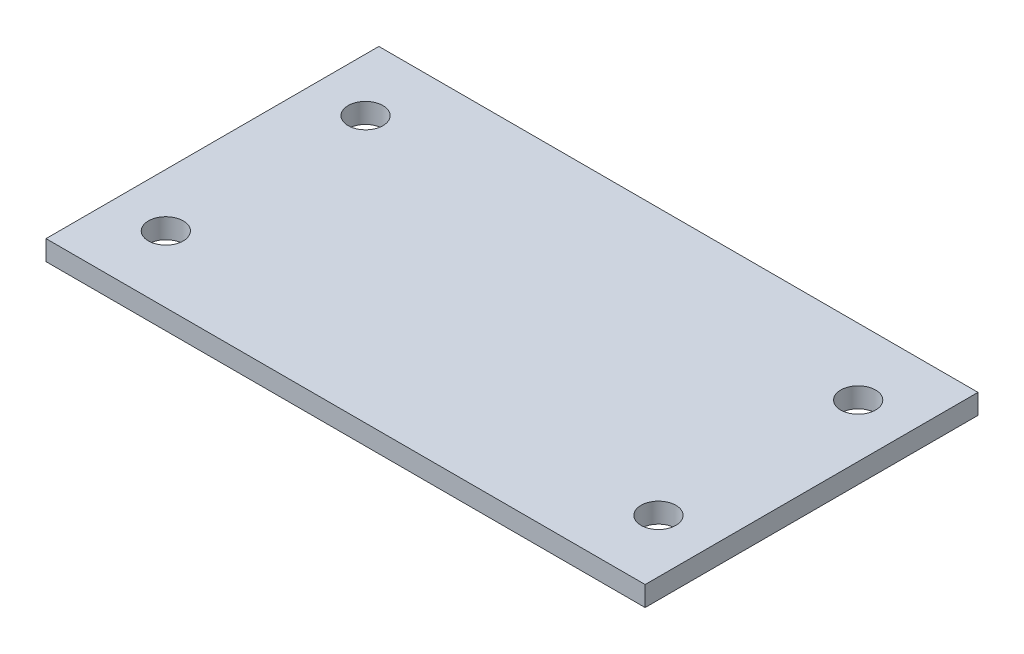
ISO-10303-21;
HEADER;
FILE_DESCRIPTION(('STEP AP214'),'2;1');
FILE_NAME('part.step','',(''),(''),'','','');
FILE_SCHEMA(('AUTOMOTIVE_DESIGN { 1 0 10303 214 1 1 1 1 }'));
ENDSEC;
DATA;
#1=APPLICATION_CONTEXT('core data for automotive mechanical design processes');
#2=APPLICATION_PROTOCOL_DEFINITION('international standard','automotive_design',2000,#1);
#3=PRODUCT_CONTEXT('',#1,'mechanical');
#4=PRODUCT('Part','Part','',(#3));
#5=PRODUCT_RELATED_PRODUCT_CATEGORY('part','',(#4));
#6=PRODUCT_DEFINITION_FORMATION('','',#4);
#7=PRODUCT_DEFINITION_CONTEXT('part definition',#1,'design');
#8=PRODUCT_DEFINITION('design','',#6,#7);
#9=PRODUCT_DEFINITION_SHAPE('','',#8);
#10=(LENGTH_UNIT() NAMED_UNIT(*) SI_UNIT(.MILLI.,.METRE.));
#11=(NAMED_UNIT(*) PLANE_ANGLE_UNIT() SI_UNIT($,.RADIAN.));
#12=(NAMED_UNIT(*) SI_UNIT($,.STERADIAN.) SOLID_ANGLE_UNIT());
#13=UNCERTAINTY_MEASURE_WITH_UNIT(LENGTH_MEASURE(1.E-05),#10,'distance_accuracy_value','');
#14=(GEOMETRIC_REPRESENTATION_CONTEXT(3) GLOBAL_UNCERTAINTY_ASSIGNED_CONTEXT((#13)) GLOBAL_UNIT_ASSIGNED_CONTEXT((#10,
#11,#12)) REPRESENTATION_CONTEXT('',''));
#15=CARTESIAN_POINT('',(0.,0.,0.));
#16=DIRECTION('',(0.,0.,1.));
#17=DIRECTION('',(1.,0.,0.));
#18=AXIS2_PLACEMENT_3D('',#15,#16,#17);
#19=CARTESIAN_POINT('',(-45.,3.,25.));
#20=DIRECTION('',(-1.,0.,0.));
#21=DIRECTION('',(0.,0.,1.));
#22=AXIS2_PLACEMENT_3D('',#19,#20,#21);
#23=PLANE('',#22);
#24=DIRECTION('',(0.,0.,-1.));
#25=VECTOR('',#24,1.);
#26=CARTESIAN_POINT('',(-45.,0.,25.));
#27=LINE('',#26,#25);
#28=CARTESIAN_POINT('',(-45.,0.,25.));
#29=VERTEX_POINT('',#28);
#30=CARTESIAN_POINT('',(-45.,0.,-25.));
#31=VERTEX_POINT('',#30);
#32=EDGE_CURVE('E112',#29,#31,#27,.T.);
#33=ORIENTED_EDGE('',*,*,#32,.F.);
#34=DIRECTION('',(0.,-1.,0.));
#35=VECTOR('',#34,1.);
#36=CARTESIAN_POINT('',(-45.,3.,25.));
#37=LINE('',#36,#35);
#38=CARTESIAN_POINT('',(-45.,3.,25.));
#39=VERTEX_POINT('',#38);
#40=EDGE_CURVE('E11',#39,#29,#37,.T.);
#41=ORIENTED_EDGE('',*,*,#40,.F.);
#42=DIRECTION('',(0.,0.,-1.));
#43=VECTOR('',#42,1.);
#44=CARTESIAN_POINT('',(-45.,3.,25.));
#45=LINE('',#44,#43);
#46=CARTESIAN_POINT('',(-45.,3.,-25.));
#47=VERTEX_POINT('',#46);
#48=EDGE_CURVE('E104',#39,#47,#45,.T.);
#49=ORIENTED_EDGE('',*,*,#48,.T.);
#50=DIRECTION('',(0.,-1.,0.));
#51=VECTOR('',#50,1.);
#52=CARTESIAN_POINT('',(-45.,3.,-25.));
#53=LINE('',#52,#51);
#54=EDGE_CURVE('E80',#47,#31,#53,.T.);
#55=ORIENTED_EDGE('',*,*,#54,.T.);
#56=EDGE_LOOP('',(#33,#41,#49,#55));
#57=FACE_BOUND('',#56,.T.);
#58=ADVANCED_FACE('F38',(#57),#23,.T.);
#59=CARTESIAN_POINT('',(-45.,3.,25.));
#60=DIRECTION('',(0.,0.,-1.));
#61=DIRECTION('',(-1.,0.,0.));
#62=AXIS2_PLACEMENT_3D('',#59,#60,#61);
#63=PLANE('',#62);
#64=DIRECTION('',(1.,0.,0.));
#65=VECTOR('',#64,1.);
#66=CARTESIAN_POINT('',(-45.,0.,25.));
#67=LINE('',#66,#65);
#68=CARTESIAN_POINT('',(45.,0.,25.));
#69=VERTEX_POINT('',#68);
#70=EDGE_CURVE('E72',#29,#69,#67,.T.);
#71=ORIENTED_EDGE('',*,*,#70,.T.);
#72=DIRECTION('',(0.,-1.,0.));
#73=VECTOR('',#72,1.);
#74=CARTESIAN_POINT('',(45.,3.,25.));
#75=LINE('',#74,#73);
#76=CARTESIAN_POINT('',(45.,3.,25.));
#77=VERTEX_POINT('',#76);
#78=EDGE_CURVE('E48',#77,#69,#75,.T.);
#79=ORIENTED_EDGE('',*,*,#78,.F.);
#80=DIRECTION('',(1.,0.,0.));
#81=VECTOR('',#80,1.);
#82=CARTESIAN_POINT('',(-45.,3.,25.));
#83=LINE('',#82,#81);
#84=EDGE_CURVE('E90',#39,#77,#83,.T.);
#85=ORIENTED_EDGE('',*,*,#84,.F.);
#86=ORIENTED_EDGE('',*,*,#40,.T.);
#87=EDGE_LOOP('',(#71,#79,#85,#86));
#88=FACE_BOUND('',#87,.T.);
#89=ADVANCED_FACE('F158',(#88),#63,.F.);
#90=CARTESIAN_POINT('',(45.,3.,25.));
#91=DIRECTION('',(-1.,0.,0.));
#92=DIRECTION('',(0.,0.,1.));
#93=AXIS2_PLACEMENT_3D('',#90,#91,#92);
#94=PLANE('',#93);
#95=DIRECTION('',(0.,0.,-1.));
#96=VECTOR('',#95,1.);
#97=CARTESIAN_POINT('',(45.,0.,25.));
#98=LINE('',#97,#96);
#99=CARTESIAN_POINT('',(45.,0.,-25.));
#100=VERTEX_POINT('',#99);
#101=EDGE_CURVE('E98',#69,#100,#98,.T.);
#102=ORIENTED_EDGE('',*,*,#101,.T.);
#103=DIRECTION('',(0.,-1.,0.));
#104=VECTOR('',#103,1.);
#105=CARTESIAN_POINT('',(45.,3.,-25.));
#106=LINE('',#105,#104);
#107=CARTESIAN_POINT('',(45.,3.,-25.));
#108=VERTEX_POINT('',#107);
#109=EDGE_CURVE('E95',#108,#100,#106,.T.);
#110=ORIENTED_EDGE('',*,*,#109,.F.);
#111=DIRECTION('',(0.,0.,-1.));
#112=VECTOR('',#111,1.);
#113=CARTESIAN_POINT('',(45.,3.,25.));
#114=LINE('',#113,#112);
#115=EDGE_CURVE('E85',#77,#108,#114,.T.);
#116=ORIENTED_EDGE('',*,*,#115,.F.);
#117=ORIENTED_EDGE('',*,*,#78,.T.);
#118=EDGE_LOOP('',(#102,#110,#116,#117));
#119=FACE_BOUND('',#118,.T.);
#120=ADVANCED_FACE('F96',(#119),#94,.F.);
#121=CARTESIAN_POINT('',(-45.,3.,-25.));
#122=DIRECTION('',(0.,0.,-1.));
#123=DIRECTION('',(-1.,0.,0.));
#124=AXIS2_PLACEMENT_3D('',#121,#122,#123);
#125=PLANE('',#124);
#126=DIRECTION('',(1.,0.,0.));
#127=VECTOR('',#126,1.);
#128=CARTESIAN_POINT('',(-45.,0.,-25.));
#129=LINE('',#128,#127);
#130=EDGE_CURVE('E116',#31,#100,#129,.T.);
#131=ORIENTED_EDGE('',*,*,#130,.F.);
#132=ORIENTED_EDGE('',*,*,#54,.F.);
#133=DIRECTION('',(1.,0.,0.));
#134=VECTOR('',#133,1.);
#135=CARTESIAN_POINT('',(-45.,3.,-25.));
#136=LINE('',#135,#134);
#137=EDGE_CURVE('E89',#47,#108,#136,.T.);
#138=ORIENTED_EDGE('',*,*,#137,.T.);
#139=ORIENTED_EDGE('',*,*,#109,.T.);
#140=EDGE_LOOP('',(#131,#132,#138,#139));
#141=FACE_BOUND('',#140,.T.);
#142=ADVANCED_FACE('F102',(#141),#125,.T.);
#143=CARTESIAN_POINT('',(0.,3.,0.));
#144=DIRECTION('',(0.,-1.,0.));
#145=DIRECTION('',(0.,0.,-1.));
#146=AXIS2_PLACEMENT_3D('',#143,#144,#145);
#147=PLANE('',#146);
#148=CARTESIAN_POINT('',(37.,3.,-15.));
#149=DIRECTION('',(0.,1.,0.));
#150=DIRECTION('',(0.,0.,-1.));
#151=AXIS2_PLACEMENT_3D('',#148,#149,#150);
#152=CIRCLE('',#151,2.616763909565);
#153=CARTESIAN_POINT('',(37.,3.,-12.383236090435));
#154=VERTEX_POINT('',#153);
#155=EDGE_CURVE('E203',#154,#154,#152,.T.);
#156=ORIENTED_EDGE('',*,*,#155,.F.);
#157=EDGE_LOOP('',(#156));
#158=FACE_BOUND('',#157,.T.);
#159=CARTESIAN_POINT('',(37.,3.,15.));
#160=DIRECTION('',(0.,1.,0.));
#161=DIRECTION('',(0.,0.,1.));
#162=AXIS2_PLACEMENT_3D('',#159,#160,#161);
#163=CIRCLE('',#162,2.616763909565);
#164=CARTESIAN_POINT('',(37.,3.,17.616763909565));
#165=VERTEX_POINT('',#164);
#166=EDGE_CURVE('E197',#165,#165,#163,.T.);
#167=ORIENTED_EDGE('',*,*,#166,.F.);
#168=EDGE_LOOP('',(#167));
#169=FACE_BOUND('',#168,.T.);
#170=CARTESIAN_POINT('',(-37.,3.,15.));
#171=DIRECTION('',(0.,1.,0.));
#172=DIRECTION('',(0.,0.,-1.));
#173=AXIS2_PLACEMENT_3D('',#170,#171,#172);
#174=CIRCLE('',#173,2.616763909565);
#175=CARTESIAN_POINT('',(-37.,3.,17.616763909565));
#176=VERTEX_POINT('',#175);
#177=EDGE_CURVE('E194',#176,#176,#174,.T.);
#178=ORIENTED_EDGE('',*,*,#177,.F.);
#179=EDGE_LOOP('',(#178));
#180=FACE_BOUND('',#179,.T.);
#181=CARTESIAN_POINT('',(-37.,3.,-15.));
#182=DIRECTION('',(0.,1.,0.));
#183=DIRECTION('',(0.,0.,1.));
#184=AXIS2_PLACEMENT_3D('',#181,#182,#183);
#185=CIRCLE('',#184,2.616763909565);
#186=CARTESIAN_POINT('',(-37.,3.,-12.383236090435));
#187=VERTEX_POINT('',#186);
#188=EDGE_CURVE('E132',#187,#187,#185,.T.);
#189=ORIENTED_EDGE('',*,*,#188,.F.);
#190=EDGE_LOOP('',(#189));
#191=FACE_BOUND('',#190,.T.);
#192=ORIENTED_EDGE('',*,*,#48,.F.);
#193=ORIENTED_EDGE('',*,*,#84,.T.);
#194=ORIENTED_EDGE('',*,*,#115,.T.);
#195=ORIENTED_EDGE('',*,*,#137,.F.);
#196=EDGE_LOOP('',(#192,#193,#194,#195));
#197=FACE_BOUND('',#196,.T.);
#198=ADVANCED_FACE('F88',(#158,#169,#180,#191,#197),#147,.F.);
#199=CARTESIAN_POINT('',(0.,0.,0.));
#200=DIRECTION('',(0.,-1.,0.));
#201=DIRECTION('',(0.,0.,-1.));
#202=AXIS2_PLACEMENT_3D('',#199,#200,#201);
#203=PLANE('',#202);
#204=CARTESIAN_POINT('',(37.,0.,-15.));
#205=DIRECTION('',(0.,-1.,0.));
#206=DIRECTION('',(0.,0.,-1.));
#207=AXIS2_PLACEMENT_3D('',#204,#205,#206);
#208=CIRCLE('',#207,2.616763909565);
#209=CARTESIAN_POINT('',(37.,0.,-12.383236090435));
#210=VERTEX_POINT('',#209);
#211=EDGE_CURVE('E41',#210,#210,#208,.T.);
#212=ORIENTED_EDGE('',*,*,#211,.F.);
#213=EDGE_LOOP('',(#212));
#214=FACE_BOUND('',#213,.T.);
#215=CARTESIAN_POINT('',(37.,0.,15.));
#216=DIRECTION('',(0.,-1.,0.));
#217=DIRECTION('',(0.,0.,-1.));
#218=AXIS2_PLACEMENT_3D('',#215,#216,#217);
#219=CIRCLE('',#218,2.616763909565);
#220=CARTESIAN_POINT('',(37.,0.,17.616763909565));
#221=VERTEX_POINT('',#220);
#222=EDGE_CURVE('E135',#221,#221,#219,.T.);
#223=ORIENTED_EDGE('',*,*,#222,.F.);
#224=EDGE_LOOP('',(#223));
#225=FACE_BOUND('',#224,.T.);
#226=CARTESIAN_POINT('',(-37.,0.,15.));
#227=DIRECTION('',(0.,-1.,0.));
#228=DIRECTION('',(0.,0.,-1.));
#229=AXIS2_PLACEMENT_3D('',#226,#227,#228);
#230=CIRCLE('',#229,2.616763909565);
#231=CARTESIAN_POINT('',(-37.,0.,17.616763909565));
#232=VERTEX_POINT('',#231);
#233=EDGE_CURVE('E131',#232,#232,#230,.T.);
#234=ORIENTED_EDGE('',*,*,#233,.F.);
#235=EDGE_LOOP('',(#234));
#236=FACE_BOUND('',#235,.T.);
#237=CARTESIAN_POINT('',(-37.,0.,-15.));
#238=DIRECTION('',(0.,-1.,0.));
#239=DIRECTION('',(0.,0.,-1.));
#240=AXIS2_PLACEMENT_3D('',#237,#238,#239);
#241=CIRCLE('',#240,2.616763909565);
#242=CARTESIAN_POINT('',(-37.,0.,-12.383236090435));
#243=VERTEX_POINT('',#242);
#244=EDGE_CURVE('E127',#243,#243,#241,.T.);
#245=ORIENTED_EDGE('',*,*,#244,.F.);
#246=EDGE_LOOP('',(#245));
#247=FACE_BOUND('',#246,.T.);
#248=ORIENTED_EDGE('',*,*,#32,.T.);
#249=ORIENTED_EDGE('',*,*,#130,.T.);
#250=ORIENTED_EDGE('',*,*,#101,.F.);
#251=ORIENTED_EDGE('',*,*,#70,.F.);
#252=EDGE_LOOP('',(#248,#249,#250,#251));
#253=FACE_BOUND('',#252,.T.);
#254=ADVANCED_FACE('F147',(#214,#225,#236,#247,#253),#203,.T.);
#255=CARTESIAN_POINT('',(-37.,-1.2E-05,-15.));
#256=DIRECTION('',(0.,1.,0.));
#257=DIRECTION('',(0.,0.,1.));
#258=AXIS2_PLACEMENT_3D('',#255,#256,#257);
#259=CYLINDRICAL_SURFACE('',#258,2.616763909565);
#260=CARTESIAN_POINT('',(-37.,0.,-12.383236090435));
#261=CARTESIAN_POINT('',(-37.,0.03125,-12.383236090435));
#262=CARTESIAN_POINT('',(-37.,0.0625,-12.383236090435));
#263=CARTESIAN_POINT('',(-37.,0.125,-12.383236090435));
#264=CARTESIAN_POINT('',(-37.,0.15625,-12.383236090435));
#265=CARTESIAN_POINT('',(-37.,0.21875,-12.383236090435));
#266=CARTESIAN_POINT('',(-37.,0.25,-12.383236090435));
#267=CARTESIAN_POINT('',(-37.,0.3125,-12.383236090435));
#268=CARTESIAN_POINT('',(-37.,0.34375,-12.383236090435));
#269=CARTESIAN_POINT('',(-37.,0.40625,-12.383236090435));
#270=CARTESIAN_POINT('',(-37.,0.4375,-12.383236090435));
#271=CARTESIAN_POINT('',(-37.,0.5,-12.383236090435));
#272=CARTESIAN_POINT('',(-37.,0.53125,-12.383236090435));
#273=CARTESIAN_POINT('',(-37.,0.59375,-12.383236090435));
#274=CARTESIAN_POINT('',(-37.,0.625,-12.383236090435));
#275=CARTESIAN_POINT('',(-37.,0.6875,-12.383236090435));
#276=CARTESIAN_POINT('',(-37.,0.71875,-12.383236090435));
#277=CARTESIAN_POINT('',(-37.,0.78125,-12.383236090435));
#278=CARTESIAN_POINT('',(-37.,0.8125,-12.383236090435));
#279=CARTESIAN_POINT('',(-37.,0.875,-12.383236090435));
#280=CARTESIAN_POINT('',(-37.,0.90625,-12.383236090435));
#281=CARTESIAN_POINT('',(-37.,0.96875,-12.383236090435));
#282=CARTESIAN_POINT('',(-37.,1.,-12.383236090435));
#283=CARTESIAN_POINT('',(-37.,1.0625,-12.383236090435));
#284=CARTESIAN_POINT('',(-37.,1.09375,-12.383236090435));
#285=CARTESIAN_POINT('',(-37.,1.15625,-12.383236090435));
#286=CARTESIAN_POINT('',(-37.,1.1875,-12.383236090435));
#287=CARTESIAN_POINT('',(-37.,1.25,-12.383236090435));
#288=CARTESIAN_POINT('',(-37.,1.28125,-12.383236090435));
#289=CARTESIAN_POINT('',(-37.,1.34375,-12.383236090435));
#290=CARTESIAN_POINT('',(-37.,1.375,-12.383236090435));
#291=CARTESIAN_POINT('',(-37.,1.4375,-12.383236090435));
#292=CARTESIAN_POINT('',(-37.,1.46875,-12.383236090435));
#293=CARTESIAN_POINT('',(-37.,1.53125,-12.383236090435));
#294=CARTESIAN_POINT('',(-37.,1.5625,-12.383236090435));
#295=CARTESIAN_POINT('',(-37.,1.625,-12.383236090435));
#296=CARTESIAN_POINT('',(-37.,1.65625,-12.383236090435));
#297=CARTESIAN_POINT('',(-37.,1.71875,-12.383236090435));
#298=CARTESIAN_POINT('',(-37.,1.75,-12.383236090435));
#299=CARTESIAN_POINT('',(-37.,1.8125,-12.383236090435));
#300=CARTESIAN_POINT('',(-37.,1.84375,-12.383236090435));
#301=CARTESIAN_POINT('',(-37.,1.90625,-12.383236090435));
#302=CARTESIAN_POINT('',(-37.,1.9375,-12.383236090435));
#303=CARTESIAN_POINT('',(-37.,2.,-12.383236090435));
#304=CARTESIAN_POINT('',(-37.,2.03125,-12.383236090435));
#305=CARTESIAN_POINT('',(-37.,2.09375,-12.383236090435));
#306=CARTESIAN_POINT('',(-37.,2.125,-12.383236090435));
#307=CARTESIAN_POINT('',(-37.,2.1875,-12.383236090435));
#308=CARTESIAN_POINT('',(-37.,2.21875,-12.383236090435));
#309=CARTESIAN_POINT('',(-37.,2.28125,-12.383236090435));
#310=CARTESIAN_POINT('',(-37.,2.3125,-12.383236090435));
#311=CARTESIAN_POINT('',(-37.,2.375,-12.383236090435));
#312=CARTESIAN_POINT('',(-37.,2.40625,-12.383236090435));
#313=CARTESIAN_POINT('',(-37.,2.46875,-12.383236090435));
#314=CARTESIAN_POINT('',(-37.,2.5,-12.383236090435));
#315=CARTESIAN_POINT('',(-37.,2.5625,-12.383236090435));
#316=CARTESIAN_POINT('',(-37.,2.59375,-12.383236090435));
#317=CARTESIAN_POINT('',(-37.,2.65625,-12.383236090435));
#318=CARTESIAN_POINT('',(-37.,2.6875,-12.383236090435));
#319=CARTESIAN_POINT('',(-37.,2.75,-12.383236090435));
#320=CARTESIAN_POINT('',(-37.,2.78125,-12.383236090435));
#321=CARTESIAN_POINT('',(-37.,2.84375,-12.383236090435));
#322=CARTESIAN_POINT('',(-37.,2.875,-12.383236090435));
#323=CARTESIAN_POINT('',(-37.,2.9375,-12.383236090435));
#324=CARTESIAN_POINT('',(-37.,2.96875,-12.383236090435));
#325=CARTESIAN_POINT('',(-37.,3.,-12.383236090435));
#326=B_SPLINE_CURVE_WITH_KNOTS('',3,(#260,#261,#262,#263,#264,#265,#266,#267,#268,#269,#270,
#271,#272,#273,#274,#275,#276,#277,#278,#279,#280,#281,#282,#283,#284,#285,#286,#287,#288,#289,
#290,#291,#292,#293,#294,#295,#296,#297,#298,#299,#300,#301,#302,#303,#304,#305,#306,#307,#308,
#309,#310,#311,#312,#313,#314,#315,#316,#317,#318,#319,#320,#321,#322,#323,#324,#325),
.UNSPECIFIED.,.F.,.F.,(4,2,2,2,2,2,2,2,2,2,2,2,2,2,2,2,2,2,2,2,2,2,2,2,2,2,2,2,2,2,2,2,4),(0.,
0.09375,0.1875,0.28125,0.375,0.46875,0.5625,0.65625,0.75,0.84375,0.9375,1.03125,1.125,1.21875,
1.3125,1.40625,1.5,1.59375,1.6875,1.78125,1.875,1.96875,2.0625,2.15625,2.25,2.34375,2.4375,
2.53125,2.625,2.71875,2.8125,2.90625,3.),.UNSPECIFIED.);
#327=EDGE_CURVE('BSEAM150',#243,#187,#326,.T.);
#328=ORIENTED_EDGE('',*,*,#244,.T.);
#329=ORIENTED_EDGE('',*,*,#188,.T.);
#330=ORIENTED_EDGE('',*,*,#327,.T.);
#331=ORIENTED_EDGE('',*,*,#327,.F.);
#332=EDGE_LOOP('',(#328,#330,#329,#331));
#333=FACE_BOUND('',#332,.T.);
#334=ADVANCED_FACE('F150',(#333),#259,.F.);
#335=CARTESIAN_POINT('',(-37.,-1.2E-05,15.));
#336=DIRECTION('',(0.,1.,0.));
#337=DIRECTION('',(0.,0.,1.));
#338=AXIS2_PLACEMENT_3D('',#335,#336,#337);
#339=CYLINDRICAL_SURFACE('',#338,2.616763909565);
#340=CARTESIAN_POINT('',(-37.,0.,17.616763909565));
#341=CARTESIAN_POINT('',(-37.,0.03125,17.616763909565));
#342=CARTESIAN_POINT('',(-37.,0.0625,17.616763909565));
#343=CARTESIAN_POINT('',(-37.,0.125,17.616763909565));
#344=CARTESIAN_POINT('',(-37.,0.15625,17.616763909565));
#345=CARTESIAN_POINT('',(-37.,0.21875,17.616763909565));
#346=CARTESIAN_POINT('',(-37.,0.25,17.616763909565));
#347=CARTESIAN_POINT('',(-37.,0.3125,17.616763909565));
#348=CARTESIAN_POINT('',(-37.,0.34375,17.616763909565));
#349=CARTESIAN_POINT('',(-37.,0.40625,17.616763909565));
#350=CARTESIAN_POINT('',(-37.,0.4375,17.616763909565));
#351=CARTESIAN_POINT('',(-37.,0.5,17.616763909565));
#352=CARTESIAN_POINT('',(-37.,0.53125,17.616763909565));
#353=CARTESIAN_POINT('',(-37.,0.59375,17.616763909565));
#354=CARTESIAN_POINT('',(-37.,0.625,17.616763909565));
#355=CARTESIAN_POINT('',(-37.,0.6875,17.616763909565));
#356=CARTESIAN_POINT('',(-37.,0.71875,17.616763909565));
#357=CARTESIAN_POINT('',(-37.,0.78125,17.616763909565));
#358=CARTESIAN_POINT('',(-37.,0.8125,17.616763909565));
#359=CARTESIAN_POINT('',(-37.,0.875,17.616763909565));
#360=CARTESIAN_POINT('',(-37.,0.90625,17.616763909565));
#361=CARTESIAN_POINT('',(-37.,0.96875,17.616763909565));
#362=CARTESIAN_POINT('',(-37.,1.,17.616763909565));
#363=CARTESIAN_POINT('',(-37.,1.0625,17.616763909565));
#364=CARTESIAN_POINT('',(-37.,1.09375,17.616763909565));
#365=CARTESIAN_POINT('',(-37.,1.15625,17.616763909565));
#366=CARTESIAN_POINT('',(-37.,1.1875,17.616763909565));
#367=CARTESIAN_POINT('',(-37.,1.25,17.616763909565));
#368=CARTESIAN_POINT('',(-37.,1.28125,17.616763909565));
#369=CARTESIAN_POINT('',(-37.,1.34375,17.616763909565));
#370=CARTESIAN_POINT('',(-37.,1.375,17.616763909565));
#371=CARTESIAN_POINT('',(-37.,1.4375,17.616763909565));
#372=CARTESIAN_POINT('',(-37.,1.46875,17.616763909565));
#373=CARTESIAN_POINT('',(-37.,1.53125,17.616763909565));
#374=CARTESIAN_POINT('',(-37.,1.5625,17.616763909565));
#375=CARTESIAN_POINT('',(-37.,1.625,17.616763909565));
#376=CARTESIAN_POINT('',(-37.,1.65625,17.616763909565));
#377=CARTESIAN_POINT('',(-37.,1.71875,17.616763909565));
#378=CARTESIAN_POINT('',(-37.,1.75,17.616763909565));
#379=CARTESIAN_POINT('',(-37.,1.8125,17.616763909565));
#380=CARTESIAN_POINT('',(-37.,1.84375,17.616763909565));
#381=CARTESIAN_POINT('',(-37.,1.90625,17.616763909565));
#382=CARTESIAN_POINT('',(-37.,1.9375,17.616763909565));
#383=CARTESIAN_POINT('',(-37.,2.,17.616763909565));
#384=CARTESIAN_POINT('',(-37.,2.03125,17.616763909565));
#385=CARTESIAN_POINT('',(-37.,2.09375,17.616763909565));
#386=CARTESIAN_POINT('',(-37.,2.125,17.616763909565));
#387=CARTESIAN_POINT('',(-37.,2.1875,17.616763909565));
#388=CARTESIAN_POINT('',(-37.,2.21875,17.616763909565));
#389=CARTESIAN_POINT('',(-37.,2.28125,17.616763909565));
#390=CARTESIAN_POINT('',(-37.,2.3125,17.616763909565));
#391=CARTESIAN_POINT('',(-37.,2.375,17.616763909565));
#392=CARTESIAN_POINT('',(-37.,2.40625,17.616763909565));
#393=CARTESIAN_POINT('',(-37.,2.46875,17.616763909565));
#394=CARTESIAN_POINT('',(-37.,2.5,17.616763909565));
#395=CARTESIAN_POINT('',(-37.,2.5625,17.616763909565));
#396=CARTESIAN_POINT('',(-37.,2.59375,17.616763909565));
#397=CARTESIAN_POINT('',(-37.,2.65625,17.616763909565));
#398=CARTESIAN_POINT('',(-37.,2.6875,17.616763909565));
#399=CARTESIAN_POINT('',(-37.,2.75,17.616763909565));
#400=CARTESIAN_POINT('',(-37.,2.78125,17.616763909565));
#401=CARTESIAN_POINT('',(-37.,2.84375,17.616763909565));
#402=CARTESIAN_POINT('',(-37.,2.875,17.616763909565));
#403=CARTESIAN_POINT('',(-37.,2.9375,17.616763909565));
#404=CARTESIAN_POINT('',(-37.,2.96875,17.616763909565));
#405=CARTESIAN_POINT('',(-37.,3.,17.616763909565));
#406=B_SPLINE_CURVE_WITH_KNOTS('',3,(#340,#341,#342,#343,#344,#345,#346,#347,#348,#349,#350,
#351,#352,#353,#354,#355,#356,#357,#358,#359,#360,#361,#362,#363,#364,#365,#366,#367,#368,#369,
#370,#371,#372,#373,#374,#375,#376,#377,#378,#379,#380,#381,#382,#383,#384,#385,#386,#387,#388,
#389,#390,#391,#392,#393,#394,#395,#396,#397,#398,#399,#400,#401,#402,#403,#404,#405),
.UNSPECIFIED.,.F.,.F.,(4,2,2,2,2,2,2,2,2,2,2,2,2,2,2,2,2,2,2,2,2,2,2,2,2,2,2,2,2,2,2,2,4),(0.,
0.09375,0.1875,0.28125,0.375,0.46875,0.5625,0.65625,0.75,0.84375,0.9375,1.03125,1.125,1.21875,
1.3125,1.40625,1.5,1.59375,1.6875,1.78125,1.875,1.96875,2.0625,2.15625,2.25,2.34375,2.4375,
2.53125,2.625,2.71875,2.8125,2.90625,3.),.UNSPECIFIED.);
#407=EDGE_CURVE('BSEAM180',#232,#176,#406,.T.);
#408=ORIENTED_EDGE('',*,*,#233,.T.);
#409=ORIENTED_EDGE('',*,*,#177,.T.);
#410=ORIENTED_EDGE('',*,*,#407,.T.);
#411=ORIENTED_EDGE('',*,*,#407,.F.);
#412=EDGE_LOOP('',(#408,#410,#409,#411));
#413=FACE_BOUND('',#412,.T.);
#414=ADVANCED_FACE('F180',(#413),#339,.F.);
#415=CARTESIAN_POINT('',(37.,-1.2E-05,15.));
#416=DIRECTION('',(0.,1.,0.));
#417=DIRECTION('',(0.,0.,1.));
#418=AXIS2_PLACEMENT_3D('',#415,#416,#417);
#419=CYLINDRICAL_SURFACE('',#418,2.616763909565);
#420=CARTESIAN_POINT('',(37.,0.,17.616763909565));
#421=CARTESIAN_POINT('',(37.,0.03125,17.616763909565));
#422=CARTESIAN_POINT('',(37.,0.0625,17.616763909565));
#423=CARTESIAN_POINT('',(37.,0.125,17.616763909565));
#424=CARTESIAN_POINT('',(37.,0.15625,17.616763909565));
#425=CARTESIAN_POINT('',(37.,0.21875,17.616763909565));
#426=CARTESIAN_POINT('',(37.,0.25,17.616763909565));
#427=CARTESIAN_POINT('',(37.,0.3125,17.616763909565));
#428=CARTESIAN_POINT('',(37.,0.34375,17.616763909565));
#429=CARTESIAN_POINT('',(37.,0.40625,17.616763909565));
#430=CARTESIAN_POINT('',(37.,0.4375,17.616763909565));
#431=CARTESIAN_POINT('',(37.,0.5,17.616763909565));
#432=CARTESIAN_POINT('',(37.,0.53125,17.616763909565));
#433=CARTESIAN_POINT('',(37.,0.59375,17.616763909565));
#434=CARTESIAN_POINT('',(37.,0.625,17.616763909565));
#435=CARTESIAN_POINT('',(37.,0.6875,17.616763909565));
#436=CARTESIAN_POINT('',(37.,0.71875,17.616763909565));
#437=CARTESIAN_POINT('',(37.,0.78125,17.616763909565));
#438=CARTESIAN_POINT('',(37.,0.8125,17.616763909565));
#439=CARTESIAN_POINT('',(37.,0.875,17.616763909565));
#440=CARTESIAN_POINT('',(37.,0.90625,17.616763909565));
#441=CARTESIAN_POINT('',(37.,0.96875,17.616763909565));
#442=CARTESIAN_POINT('',(37.,1.,17.616763909565));
#443=CARTESIAN_POINT('',(37.,1.0625,17.616763909565));
#444=CARTESIAN_POINT('',(37.,1.09375,17.616763909565));
#445=CARTESIAN_POINT('',(37.,1.15625,17.616763909565));
#446=CARTESIAN_POINT('',(37.,1.1875,17.616763909565));
#447=CARTESIAN_POINT('',(37.,1.25,17.616763909565));
#448=CARTESIAN_POINT('',(37.,1.28125,17.616763909565));
#449=CARTESIAN_POINT('',(37.,1.34375,17.616763909565));
#450=CARTESIAN_POINT('',(37.,1.375,17.616763909565));
#451=CARTESIAN_POINT('',(37.,1.4375,17.616763909565));
#452=CARTESIAN_POINT('',(37.,1.46875,17.616763909565));
#453=CARTESIAN_POINT('',(37.,1.53125,17.616763909565));
#454=CARTESIAN_POINT('',(37.,1.5625,17.616763909565));
#455=CARTESIAN_POINT('',(37.,1.625,17.616763909565));
#456=CARTESIAN_POINT('',(37.,1.65625,17.616763909565));
#457=CARTESIAN_POINT('',(37.,1.71875,17.616763909565));
#458=CARTESIAN_POINT('',(37.,1.75,17.616763909565));
#459=CARTESIAN_POINT('',(37.,1.8125,17.616763909565));
#460=CARTESIAN_POINT('',(37.,1.84375,17.616763909565));
#461=CARTESIAN_POINT('',(37.,1.90625,17.616763909565));
#462=CARTESIAN_POINT('',(37.,1.9375,17.616763909565));
#463=CARTESIAN_POINT('',(37.,2.,17.616763909565));
#464=CARTESIAN_POINT('',(37.,2.03125,17.616763909565));
#465=CARTESIAN_POINT('',(37.,2.09375,17.616763909565));
#466=CARTESIAN_POINT('',(37.,2.125,17.616763909565));
#467=CARTESIAN_POINT('',(37.,2.1875,17.616763909565));
#468=CARTESIAN_POINT('',(37.,2.21875,17.616763909565));
#469=CARTESIAN_POINT('',(37.,2.28125,17.616763909565));
#470=CARTESIAN_POINT('',(37.,2.3125,17.616763909565));
#471=CARTESIAN_POINT('',(37.,2.375,17.616763909565));
#472=CARTESIAN_POINT('',(37.,2.40625,17.616763909565));
#473=CARTESIAN_POINT('',(37.,2.46875,17.616763909565));
#474=CARTESIAN_POINT('',(37.,2.5,17.616763909565));
#475=CARTESIAN_POINT('',(37.,2.5625,17.616763909565));
#476=CARTESIAN_POINT('',(37.,2.59375,17.616763909565));
#477=CARTESIAN_POINT('',(37.,2.65625,17.616763909565));
#478=CARTESIAN_POINT('',(37.,2.6875,17.616763909565));
#479=CARTESIAN_POINT('',(37.,2.75,17.616763909565));
#480=CARTESIAN_POINT('',(37.,2.78125,17.616763909565));
#481=CARTESIAN_POINT('',(37.,2.84375,17.616763909565));
#482=CARTESIAN_POINT('',(37.,2.875,17.616763909565));
#483=CARTESIAN_POINT('',(37.,2.9375,17.616763909565));
#484=CARTESIAN_POINT('',(37.,2.96875,17.616763909565));
#485=CARTESIAN_POINT('',(37.,3.,17.616763909565));
#486=B_SPLINE_CURVE_WITH_KNOTS('',3,(#420,#421,#422,#423,#424,#425,#426,#427,#428,#429,#430,
#431,#432,#433,#434,#435,#436,#437,#438,#439,#440,#441,#442,#443,#444,#445,#446,#447,#448,#449,
#450,#451,#452,#453,#454,#455,#456,#457,#458,#459,#460,#461,#462,#463,#464,#465,#466,#467,#468,
#469,#470,#471,#472,#473,#474,#475,#476,#477,#478,#479,#480,#481,#482,#483,#484,#485),
.UNSPECIFIED.,.F.,.F.,(4,2,2,2,2,2,2,2,2,2,2,2,2,2,2,2,2,2,2,2,2,2,2,2,2,2,2,2,2,2,2,2,4),(0.,
0.09375,0.1875,0.28125,0.375,0.46875,0.5625,0.65625,0.75,0.84375,0.9375,1.03125,1.125,1.21875,
1.3125,1.40625,1.5,1.59375,1.6875,1.78125,1.875,1.96875,2.0625,2.15625,2.25,2.34375,2.4375,
2.53125,2.625,2.71875,2.8125,2.90625,3.),.UNSPECIFIED.);
#487=EDGE_CURVE('BSEAM184',#221,#165,#486,.T.);
#488=ORIENTED_EDGE('',*,*,#222,.T.);
#489=ORIENTED_EDGE('',*,*,#166,.T.);
#490=ORIENTED_EDGE('',*,*,#487,.T.);
#491=ORIENTED_EDGE('',*,*,#487,.F.);
#492=EDGE_LOOP('',(#488,#490,#489,#491));
#493=FACE_BOUND('',#492,.T.);
#494=ADVANCED_FACE('F184',(#493),#419,.F.);
#495=CARTESIAN_POINT('',(37.,-1.2E-05,-15.));
#496=DIRECTION('',(0.,1.,0.));
#497=DIRECTION('',(0.,0.,1.));
#498=AXIS2_PLACEMENT_3D('',#495,#496,#497);
#499=CYLINDRICAL_SURFACE('',#498,2.616763909565);
#500=CARTESIAN_POINT('',(37.,0.,-12.383236090435));
#501=CARTESIAN_POINT('',(37.,0.03125,-12.383236090435));
#502=CARTESIAN_POINT('',(37.,0.0625,-12.383236090435));
#503=CARTESIAN_POINT('',(37.,0.125,-12.383236090435));
#504=CARTESIAN_POINT('',(37.,0.15625,-12.383236090435));
#505=CARTESIAN_POINT('',(37.,0.21875,-12.383236090435));
#506=CARTESIAN_POINT('',(37.,0.25,-12.383236090435));
#507=CARTESIAN_POINT('',(37.,0.3125,-12.383236090435));
#508=CARTESIAN_POINT('',(37.,0.34375,-12.383236090435));
#509=CARTESIAN_POINT('',(37.,0.40625,-12.383236090435));
#510=CARTESIAN_POINT('',(37.,0.4375,-12.383236090435));
#511=CARTESIAN_POINT('',(37.,0.5,-12.383236090435));
#512=CARTESIAN_POINT('',(37.,0.53125,-12.383236090435));
#513=CARTESIAN_POINT('',(37.,0.59375,-12.383236090435));
#514=CARTESIAN_POINT('',(37.,0.625,-12.383236090435));
#515=CARTESIAN_POINT('',(37.,0.6875,-12.383236090435));
#516=CARTESIAN_POINT('',(37.,0.71875,-12.383236090435));
#517=CARTESIAN_POINT('',(37.,0.78125,-12.383236090435));
#518=CARTESIAN_POINT('',(37.,0.8125,-12.383236090435));
#519=CARTESIAN_POINT('',(37.,0.875,-12.383236090435));
#520=CARTESIAN_POINT('',(37.,0.90625,-12.383236090435));
#521=CARTESIAN_POINT('',(37.,0.96875,-12.383236090435));
#522=CARTESIAN_POINT('',(37.,1.,-12.383236090435));
#523=CARTESIAN_POINT('',(37.,1.0625,-12.383236090435));
#524=CARTESIAN_POINT('',(37.,1.09375,-12.383236090435));
#525=CARTESIAN_POINT('',(37.,1.15625,-12.383236090435));
#526=CARTESIAN_POINT('',(37.,1.1875,-12.383236090435));
#527=CARTESIAN_POINT('',(37.,1.25,-12.383236090435));
#528=CARTESIAN_POINT('',(37.,1.28125,-12.383236090435));
#529=CARTESIAN_POINT('',(37.,1.34375,-12.383236090435));
#530=CARTESIAN_POINT('',(37.,1.375,-12.383236090435));
#531=CARTESIAN_POINT('',(37.,1.4375,-12.383236090435));
#532=CARTESIAN_POINT('',(37.,1.46875,-12.383236090435));
#533=CARTESIAN_POINT('',(37.,1.53125,-12.383236090435));
#534=CARTESIAN_POINT('',(37.,1.5625,-12.383236090435));
#535=CARTESIAN_POINT('',(37.,1.625,-12.383236090435));
#536=CARTESIAN_POINT('',(37.,1.65625,-12.383236090435));
#537=CARTESIAN_POINT('',(37.,1.71875,-12.383236090435));
#538=CARTESIAN_POINT('',(37.,1.75,-12.383236090435));
#539=CARTESIAN_POINT('',(37.,1.8125,-12.383236090435));
#540=CARTESIAN_POINT('',(37.,1.84375,-12.383236090435));
#541=CARTESIAN_POINT('',(37.,1.90625,-12.383236090435));
#542=CARTESIAN_POINT('',(37.,1.9375,-12.383236090435));
#543=CARTESIAN_POINT('',(37.,2.,-12.383236090435));
#544=CARTESIAN_POINT('',(37.,2.03125,-12.383236090435));
#545=CARTESIAN_POINT('',(37.,2.09375,-12.383236090435));
#546=CARTESIAN_POINT('',(37.,2.125,-12.383236090435));
#547=CARTESIAN_POINT('',(37.,2.1875,-12.383236090435));
#548=CARTESIAN_POINT('',(37.,2.21875,-12.383236090435));
#549=CARTESIAN_POINT('',(37.,2.28125,-12.383236090435));
#550=CARTESIAN_POINT('',(37.,2.3125,-12.383236090435));
#551=CARTESIAN_POINT('',(37.,2.375,-12.383236090435));
#552=CARTESIAN_POINT('',(37.,2.40625,-12.383236090435));
#553=CARTESIAN_POINT('',(37.,2.46875,-12.383236090435));
#554=CARTESIAN_POINT('',(37.,2.5,-12.383236090435));
#555=CARTESIAN_POINT('',(37.,2.5625,-12.383236090435));
#556=CARTESIAN_POINT('',(37.,2.59375,-12.383236090435));
#557=CARTESIAN_POINT('',(37.,2.65625,-12.383236090435));
#558=CARTESIAN_POINT('',(37.,2.6875,-12.383236090435));
#559=CARTESIAN_POINT('',(37.,2.75,-12.383236090435));
#560=CARTESIAN_POINT('',(37.,2.78125,-12.383236090435));
#561=CARTESIAN_POINT('',(37.,2.84375,-12.383236090435));
#562=CARTESIAN_POINT('',(37.,2.875,-12.383236090435));
#563=CARTESIAN_POINT('',(37.,2.9375,-12.383236090435));
#564=CARTESIAN_POINT('',(37.,2.96875,-12.383236090435));
#565=CARTESIAN_POINT('',(37.,3.,-12.383236090435));
#566=B_SPLINE_CURVE_WITH_KNOTS('',3,(#500,#501,#502,#503,#504,#505,#506,#507,#508,#509,#510,
#511,#512,#513,#514,#515,#516,#517,#518,#519,#520,#521,#522,#523,#524,#525,#526,#527,#528,#529,
#530,#531,#532,#533,#534,#535,#536,#537,#538,#539,#540,#541,#542,#543,#544,#545,#546,#547,#548,
#549,#550,#551,#552,#553,#554,#555,#556,#557,#558,#559,#560,#561,#562,#563,#564,#565),
.UNSPECIFIED.,.F.,.F.,(4,2,2,2,2,2,2,2,2,2,2,2,2,2,2,2,2,2,2,2,2,2,2,2,2,2,2,2,2,2,2,2,4),(0.,
0.09375,0.1875,0.28125,0.375,0.46875,0.5625,0.65625,0.75,0.84375,0.9375,1.03125,1.125,1.21875,
1.3125,1.40625,1.5,1.59375,1.6875,1.78125,1.875,1.96875,2.0625,2.15625,2.25,2.34375,2.4375,
2.53125,2.625,2.71875,2.8125,2.90625,3.),.UNSPECIFIED.);
#567=EDGE_CURVE('BSEAM144',#210,#154,#566,.T.);
#568=ORIENTED_EDGE('',*,*,#211,.T.);
#569=ORIENTED_EDGE('',*,*,#155,.T.);
#570=ORIENTED_EDGE('',*,*,#567,.T.);
#571=ORIENTED_EDGE('',*,*,#567,.F.);
#572=EDGE_LOOP('',(#568,#570,#569,#571));
#573=FACE_BOUND('',#572,.T.);
#574=ADVANCED_FACE('F144',(#573),#499,.F.);
#575=CLOSED_SHELL('',(#58,#89,#120,#142,#198,#254,#334,#414,#494,#574));
#576=MANIFOLD_SOLID_BREP('B2',#575);
#577=ADVANCED_BREP_SHAPE_REPRESENTATION('',(#18,#576),#14);
#578=SHAPE_DEFINITION_REPRESENTATION(#9,#577);
ENDSEC;
END-ISO-10303-21;
